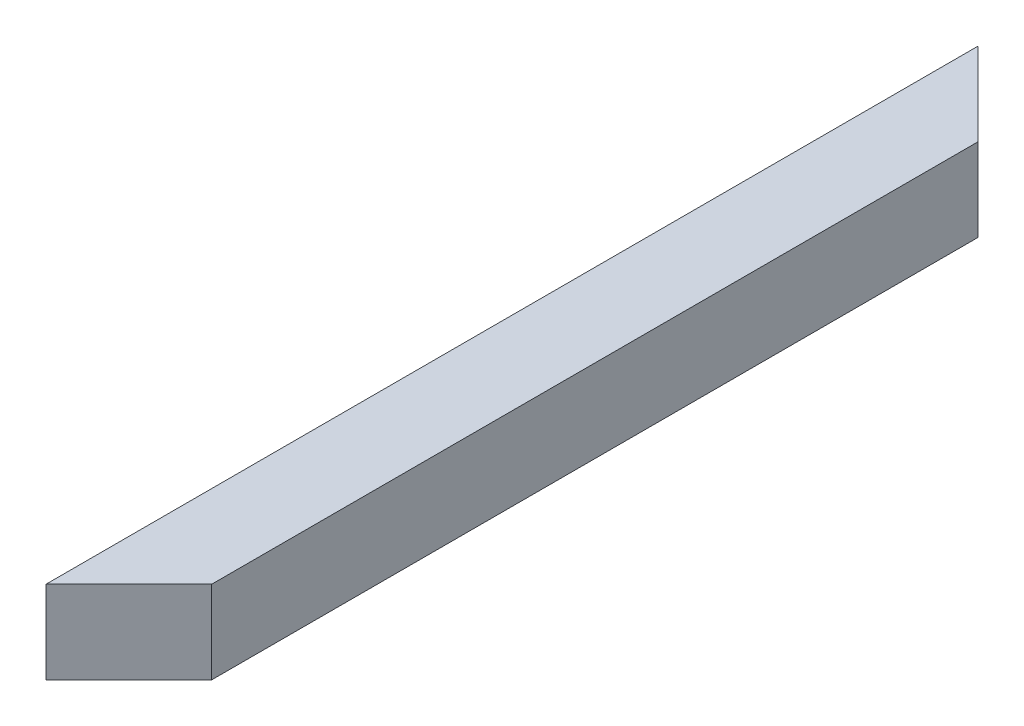
ISO-10303-21;
HEADER;
FILE_DESCRIPTION(('STEP AP214'),'2;1');
FILE_NAME('part.step','',(''),(''),'','','');
FILE_SCHEMA(('AUTOMOTIVE_DESIGN { 1 0 10303 214 1 1 1 1 }'));
ENDSEC;
DATA;
#1=APPLICATION_CONTEXT('core data for automotive mechanical design processes');
#2=APPLICATION_PROTOCOL_DEFINITION('international standard','automotive_design',2000,#1);
#3=PRODUCT_CONTEXT('',#1,'mechanical');
#4=PRODUCT('Part','Part','',(#3));
#5=PRODUCT_RELATED_PRODUCT_CATEGORY('part','',(#4));
#6=PRODUCT_DEFINITION_FORMATION('','',#4);
#7=PRODUCT_DEFINITION_CONTEXT('part definition',#1,'design');
#8=PRODUCT_DEFINITION('design','',#6,#7);
#9=PRODUCT_DEFINITION_SHAPE('','',#8);
#10=(LENGTH_UNIT() NAMED_UNIT(*) SI_UNIT(.MILLI.,.METRE.));
#11=(NAMED_UNIT(*) PLANE_ANGLE_UNIT() SI_UNIT($,.RADIAN.));
#12=(NAMED_UNIT(*) SI_UNIT($,.STERADIAN.) SOLID_ANGLE_UNIT());
#13=UNCERTAINTY_MEASURE_WITH_UNIT(LENGTH_MEASURE(1.E-05),#10,'distance_accuracy_value','');
#14=(GEOMETRIC_REPRESENTATION_CONTEXT(3) GLOBAL_UNCERTAINTY_ASSIGNED_CONTEXT((#13)) GLOBAL_UNIT_ASSIGNED_CONTEXT((#10,
#11,#12)) REPRESENTATION_CONTEXT('',''));
#15=CARTESIAN_POINT('',(0.,0.,0.));
#16=DIRECTION('',(0.,0.,1.));
#17=DIRECTION('',(1.,0.,0.));
#18=AXIS2_PLACEMENT_3D('',#15,#16,#17);
#19=CARTESIAN_POINT('',(-177.837701959767,40.,-433.106850545388));
#20=DIRECTION('',(-0.707106781186546,0.,0.707106781186549));
#21=DIRECTION('',(0.707106781186549,0.,0.707106781186546));
#22=AXIS2_PLACEMENT_3D('',#19,#20,#21);
#23=PLANE('',#22);
#24=DIRECTION('',(-0.707106781186549,0.,-0.707106781186546));
#25=VECTOR('',#24,1.);
#26=CARTESIAN_POINT('',(-177.837701959767,0.,-433.106850545388));
#27=LINE('',#26,#25);
#28=CARTESIAN_POINT('',(-137.837701959767,0.,-393.106850545388));
#29=VERTEX_POINT('',#28);
#30=CARTESIAN_POINT('',(-177.837701959767,0.,-433.106850545388));
#31=VERTEX_POINT('',#30);
#32=EDGE_CURVE('E96',#29,#31,#27,.T.);
#33=ORIENTED_EDGE('',*,*,#32,.T.);
#34=DIRECTION('',(0.,-1.,0.));
#35=VECTOR('',#34,1.);
#36=CARTESIAN_POINT('',(-177.837701959767,40.,-433.106850545388));
#37=LINE('',#36,#35);
#38=CARTESIAN_POINT('',(-177.837701959767,40.,-433.106850545388));
#39=VERTEX_POINT('',#38);
#40=EDGE_CURVE('E11',#39,#31,#37,.T.);
#41=ORIENTED_EDGE('',*,*,#40,.F.);
#42=DIRECTION('',(-0.707106781186549,0.,-0.707106781186546));
#43=VECTOR('',#42,1.);
#44=CARTESIAN_POINT('',(-177.837701959767,40.,-433.106850545388));
#45=LINE('',#44,#43);
#46=CARTESIAN_POINT('',(-137.837701959767,40.,-393.106850545388));
#47=VERTEX_POINT('',#46);
#48=EDGE_CURVE('E84',#47,#39,#45,.T.);
#49=ORIENTED_EDGE('',*,*,#48,.F.);
#50=DIRECTION('',(0.,-1.,0.));
#51=VECTOR('',#50,1.);
#52=CARTESIAN_POINT('',(-137.837701959767,40.,-393.106850545388));
#53=LINE('',#52,#51);
#54=EDGE_CURVE('E92',#47,#29,#53,.T.);
#55=ORIENTED_EDGE('',*,*,#54,.T.);
#56=EDGE_LOOP('',(#33,#41,#49,#55));
#57=FACE_BOUND('',#56,.T.);
#58=ADVANCED_FACE('F33',(#57),#23,.F.);
#59=CARTESIAN_POINT('',(-177.837701959767,40.,-433.106850545388));
#60=DIRECTION('',(1.,0.,0.));
#61=DIRECTION('',(0.,0.,-1.));
#62=AXIS2_PLACEMENT_3D('',#59,#60,#61);
#63=PLANE('',#62);
#64=DIRECTION('',(0.,0.,1.));
#65=VECTOR('',#64,1.);
#66=CARTESIAN_POINT('',(-177.837701959767,0.,-433.106850545388));
#67=LINE('',#66,#65);
#68=CARTESIAN_POINT('',(-177.837701959767,0.,16.8931494546119));
#69=VERTEX_POINT('',#68);
#70=EDGE_CURVE('E88',#31,#69,#67,.T.);
#71=ORIENTED_EDGE('',*,*,#70,.T.);
#72=DIRECTION('',(0.,-1.,0.));
#73=VECTOR('',#72,1.);
#74=CARTESIAN_POINT('',(-177.837701959767,40.,16.8931494546119));
#75=LINE('',#74,#73);
#76=CARTESIAN_POINT('',(-177.837701959767,40.,16.8931494546119));
#77=VERTEX_POINT('',#76);
#78=EDGE_CURVE('E41',#77,#69,#75,.T.);
#79=ORIENTED_EDGE('',*,*,#78,.F.);
#80=DIRECTION('',(0.,0.,1.));
#81=VECTOR('',#80,1.);
#82=CARTESIAN_POINT('',(-177.837701959767,40.,-433.106850545388));
#83=LINE('',#82,#81);
#84=EDGE_CURVE('E79',#39,#77,#83,.T.);
#85=ORIENTED_EDGE('',*,*,#84,.F.);
#86=ORIENTED_EDGE('',*,*,#40,.T.);
#87=EDGE_LOOP('',(#71,#79,#85,#86));
#88=FACE_BOUND('',#87,.T.);
#89=ADVANCED_FACE('F87',(#88),#63,.F.);
#90=CARTESIAN_POINT('',(-177.837701959767,40.,16.8931494546119));
#91=DIRECTION('',(-0.707106781186549,0.,-0.707106781186546));
#92=DIRECTION('',(-0.707106781186546,0.,0.707106781186549));
#93=AXIS2_PLACEMENT_3D('',#90,#91,#92);
#94=PLANE('',#93);
#95=DIRECTION('',(0.707106781186546,0.,-0.707106781186549));
#96=VECTOR('',#95,1.);
#97=CARTESIAN_POINT('',(-177.837701959767,0.,16.8931494546119));
#98=LINE('',#97,#96);
#99=CARTESIAN_POINT('',(-137.837701959767,0.,-23.1068505453883));
#100=VERTEX_POINT('',#99);
#101=EDGE_CURVE('E66',#69,#100,#98,.T.);
#102=ORIENTED_EDGE('',*,*,#101,.T.);
#103=DIRECTION('',(0.,-1.,0.));
#104=VECTOR('',#103,1.);
#105=CARTESIAN_POINT('',(-137.837701959767,40.,-23.1068505453883));
#106=LINE('',#105,#104);
#107=CARTESIAN_POINT('',(-137.837701959767,40.,-23.1068505453883));
#108=VERTEX_POINT('',#107);
#109=EDGE_CURVE('E89',#108,#100,#106,.T.);
#110=ORIENTED_EDGE('',*,*,#109,.F.);
#111=DIRECTION('',(0.707106781186546,0.,-0.707106781186549));
#112=VECTOR('',#111,1.);
#113=CARTESIAN_POINT('',(-177.837701959767,40.,16.8931494546119));
#114=LINE('',#113,#112);
#115=EDGE_CURVE('E82',#77,#108,#114,.T.);
#116=ORIENTED_EDGE('',*,*,#115,.F.);
#117=ORIENTED_EDGE('',*,*,#78,.T.);
#118=EDGE_LOOP('',(#102,#110,#116,#117));
#119=FACE_BOUND('',#118,.T.);
#120=ADVANCED_FACE('F90',(#119),#94,.F.);
#121=CARTESIAN_POINT('',(-137.837701959767,40.,-393.106850545388));
#122=DIRECTION('',(-1.,0.,0.));
#123=DIRECTION('',(0.,0.,1.));
#124=AXIS2_PLACEMENT_3D('',#121,#122,#123);
#125=PLANE('',#124);
#126=DIRECTION('',(0.,0.,-1.));
#127=VECTOR('',#126,1.);
#128=CARTESIAN_POINT('',(-137.837701959767,0.,-393.106850545388));
#129=LINE('',#128,#127);
#130=EDGE_CURVE('E72',#100,#29,#129,.T.);
#131=ORIENTED_EDGE('',*,*,#130,.T.);
#132=ORIENTED_EDGE('',*,*,#54,.F.);
#133=DIRECTION('',(0.,0.,-1.));
#134=VECTOR('',#133,1.);
#135=CARTESIAN_POINT('',(-137.837701959767,40.,-393.106850545388));
#136=LINE('',#135,#134);
#137=EDGE_CURVE('E49',#108,#47,#136,.T.);
#138=ORIENTED_EDGE('',*,*,#137,.F.);
#139=ORIENTED_EDGE('',*,*,#109,.T.);
#140=EDGE_LOOP('',(#131,#132,#138,#139));
#141=FACE_BOUND('',#140,.T.);
#142=ADVANCED_FACE('F103',(#141),#125,.F.);
#143=CARTESIAN_POINT('',(0.,40.,0.));
#144=DIRECTION('',(0.,1.,0.));
#145=DIRECTION('',(0.,0.,1.));
#146=AXIS2_PLACEMENT_3D('',#143,#144,#145);
#147=PLANE('',#146);
#148=ORIENTED_EDGE('',*,*,#48,.T.);
#149=ORIENTED_EDGE('',*,*,#84,.T.);
#150=ORIENTED_EDGE('',*,*,#115,.T.);
#151=ORIENTED_EDGE('',*,*,#137,.T.);
#152=EDGE_LOOP('',(#148,#149,#150,#151));
#153=FACE_BOUND('',#152,.T.);
#154=ADVANCED_FACE('F80',(#153),#147,.T.);
#155=CARTESIAN_POINT('',(0.,0.,0.));
#156=DIRECTION('',(0.,1.,0.));
#157=DIRECTION('',(0.,0.,1.));
#158=AXIS2_PLACEMENT_3D('',#155,#156,#157);
#159=PLANE('',#158);
#160=ORIENTED_EDGE('',*,*,#32,.F.);
#161=ORIENTED_EDGE('',*,*,#130,.F.);
#162=ORIENTED_EDGE('',*,*,#101,.F.);
#163=ORIENTED_EDGE('',*,*,#70,.F.);
#164=EDGE_LOOP('',(#160,#161,#162,#163));
#165=FACE_BOUND('',#164,.T.);
#166=ADVANCED_FACE('F106',(#165),#159,.F.);
#167=CLOSED_SHELL('',(#58,#89,#120,#142,#154,#166));
#168=MANIFOLD_SOLID_BREP('B2',#167);
#169=ADVANCED_BREP_SHAPE_REPRESENTATION('',(#18,#168),#14);
#170=SHAPE_DEFINITION_REPRESENTATION(#9,#169);
ENDSEC;
END-ISO-10303-21;
